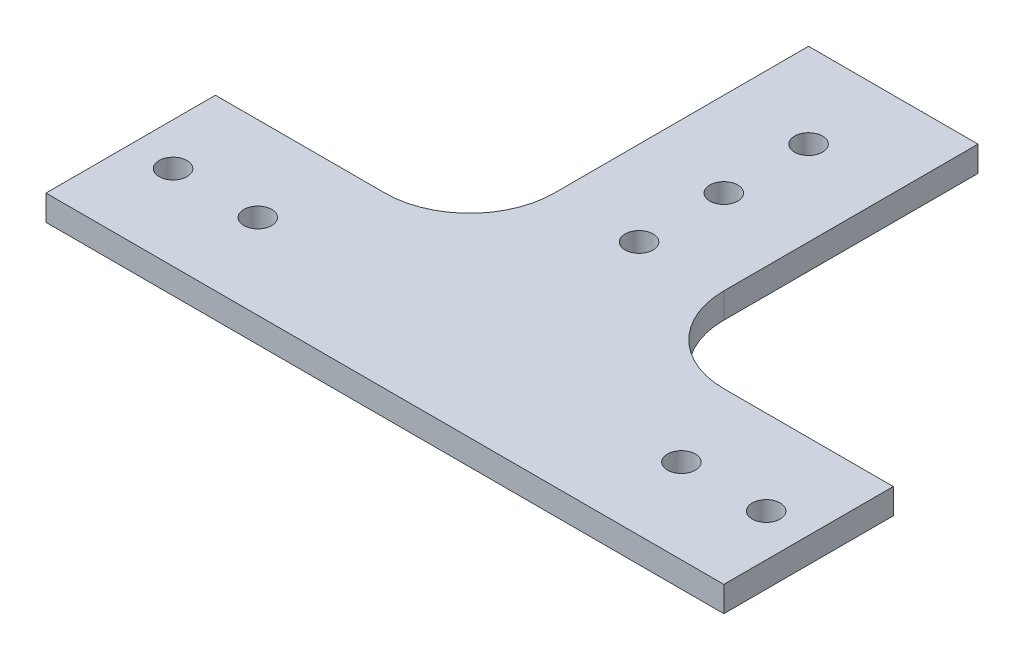
ISO-10303-21;
HEADER;
FILE_DESCRIPTION(('STEP AP214'),'2;1');
FILE_NAME('part.step','',(''),(''),'','','');
FILE_SCHEMA(('AUTOMOTIVE_DESIGN { 1 0 10303 214 1 1 1 1 }'));
ENDSEC;
DATA;
#1=APPLICATION_CONTEXT('core data for automotive mechanical design processes');
#2=APPLICATION_PROTOCOL_DEFINITION('international standard','automotive_design',2000,#1);
#3=PRODUCT_CONTEXT('',#1,'mechanical');
#4=PRODUCT('Part','Part','',(#3));
#5=PRODUCT_RELATED_PRODUCT_CATEGORY('part','',(#4));
#6=PRODUCT_DEFINITION_FORMATION('','',#4);
#7=PRODUCT_DEFINITION_CONTEXT('part definition',#1,'design');
#8=PRODUCT_DEFINITION('design','',#6,#7);
#9=PRODUCT_DEFINITION_SHAPE('','',#8);
#10=(LENGTH_UNIT() NAMED_UNIT(*) SI_UNIT(.MILLI.,.METRE.));
#11=(NAMED_UNIT(*) PLANE_ANGLE_UNIT() SI_UNIT($,.RADIAN.));
#12=(NAMED_UNIT(*) SI_UNIT($,.STERADIAN.) SOLID_ANGLE_UNIT());
#13=UNCERTAINTY_MEASURE_WITH_UNIT(LENGTH_MEASURE(1.E-05),#10,'distance_accuracy_value','');
#14=(GEOMETRIC_REPRESENTATION_CONTEXT(3) GLOBAL_UNCERTAINTY_ASSIGNED_CONTEXT((#13)) GLOBAL_UNIT_ASSIGNED_CONTEXT((#10,
#11,#12)) REPRESENTATION_CONTEXT('',''));
#15=CARTESIAN_POINT('',(0.,0.,0.));
#16=DIRECTION('',(0.,0.,1.));
#17=DIRECTION('',(1.,0.,0.));
#18=AXIS2_PLACEMENT_3D('',#15,#16,#17);
#19=CARTESIAN_POINT('',(0.,3.,0.));
#20=DIRECTION('',(0.,1.,0.));
#21=DIRECTION('',(0.,0.,1.));
#22=AXIS2_PLACEMENT_3D('',#19,#20,#21);
#23=PLANE('',#22);
#24=CARTESIAN_POINT('',(24.6658917252566,3.,20.3341082747434));
#25=DIRECTION('',(0.,1.,0.));
#26=DIRECTION('',(0.,0.,1.));
#27=AXIS2_PLACEMENT_3D('',#24,#25,#26);
#28=CIRCLE('',#27,1.65);
#29=CARTESIAN_POINT('',(24.6658917252566,3.,21.9841082747434));
#30=VERTEX_POINT('',#29);
#31=EDGE_CURVE('E244',#30,#30,#28,.T.);
#32=ORIENTED_EDGE('',*,*,#31,.F.);
#33=EDGE_LOOP('',(#32));
#34=FACE_BOUND('',#33,.T.);
#35=CARTESIAN_POINT('',(-25.3341082747434,3.,20.3341082747434));
#36=DIRECTION('',(0.,1.,0.));
#37=DIRECTION('',(0.,0.,1.));
#38=AXIS2_PLACEMENT_3D('',#35,#36,#37);
#39=CIRCLE('',#38,1.65);
#40=CARTESIAN_POINT('',(-25.3341082747434,3.,21.9841082747434));
#41=VERTEX_POINT('',#40);
#42=EDGE_CURVE('E232',#41,#41,#39,.T.);
#43=ORIENTED_EDGE('',*,*,#42,.F.);
#44=EDGE_LOOP('',(#43));
#45=FACE_BOUND('',#44,.T.);
#46=CARTESIAN_POINT('',(-0.334108274743422,3.,-9.6658917252566));
#47=DIRECTION('',(0.,1.,0.));
#48=DIRECTION('',(0.,0.,1.));
#49=AXIS2_PLACEMENT_3D('',#46,#47,#48);
#50=CIRCLE('',#49,1.65);
#51=CARTESIAN_POINT('',(-0.334108274743422,3.,-8.0158917252566));
#52=VERTEX_POINT('',#51);
#53=EDGE_CURVE('E220',#52,#52,#50,.T.);
#54=ORIENTED_EDGE('',*,*,#53,.F.);
#55=EDGE_LOOP('',(#54));
#56=FACE_BOUND('',#55,.T.);
#57=DIRECTION('',(0.,0.,1.));
#58=VECTOR('',#57,1.);
#59=CARTESIAN_POINT('',(-40.3341082747434,3.,10.3341082747434));
#60=LINE('',#59,#58);
#61=CARTESIAN_POINT('',(-40.3341082747434,3.,10.3341082747434));
#62=VERTEX_POINT('',#61);
#63=CARTESIAN_POINT('',(-40.3341082747434,3.,30.3341082747434));
#64=VERTEX_POINT('',#63);
#65=EDGE_CURVE('E129',#62,#64,#60,.T.);
#66=ORIENTED_EDGE('',*,*,#65,.T.);
#67=DIRECTION('',(1.,0.,0.));
#68=VECTOR('',#67,1.);
#69=CARTESIAN_POINT('',(-40.3341082747434,3.,30.3341082747434));
#70=LINE('',#69,#68);
#71=CARTESIAN_POINT('',(39.6658917252566,3.,30.3341082747434));
#72=VERTEX_POINT('',#71);
#73=EDGE_CURVE('E118',#64,#72,#70,.T.);
#74=ORIENTED_EDGE('',*,*,#73,.T.);
#75=DIRECTION('',(0.,0.,-1.));
#76=VECTOR('',#75,1.);
#77=CARTESIAN_POINT('',(39.6658917252566,3.,30.3341082747434));
#78=LINE('',#77,#76);
#79=CARTESIAN_POINT('',(39.6658917252566,3.,10.3341082747434));
#80=VERTEX_POINT('',#79);
#81=EDGE_CURVE('E128',#72,#80,#78,.T.);
#82=ORIENTED_EDGE('',*,*,#81,.T.);
#83=DIRECTION('',(-1.,0.,0.));
#84=VECTOR('',#83,1.);
#85=CARTESIAN_POINT('',(39.6658917252566,3.,10.3341082747434));
#86=LINE('',#85,#84);
#87=CARTESIAN_POINT('',(19.6658917252566,3.,10.3341082747434));
#88=VERTEX_POINT('',#87);
#89=EDGE_CURVE('E199',#80,#88,#86,.T.);
#90=ORIENTED_EDGE('',*,*,#89,.T.);
#91=CARTESIAN_POINT('',(19.6658917252566,3.,0.334108274743408));
#92=DIRECTION('',(0.,1.,0.));
#93=DIRECTION('',(0.,0.,1.));
#94=AXIS2_PLACEMENT_3D('',#91,#92,#93);
#95=CIRCLE('',#94,10.);
#96=CARTESIAN_POINT('',(9.66589172525658,3.,0.334108274743408));
#97=VERTEX_POINT('',#96);
#98=EDGE_CURVE('E11',#88,#97,#95,.F.);
#99=ORIENTED_EDGE('',*,*,#98,.T.);
#100=DIRECTION('',(0.,0.,-1.));
#101=VECTOR('',#100,1.);
#102=CARTESIAN_POINT('',(9.66589172525658,3.,10.3341082747434));
#103=LINE('',#102,#101);
#104=CARTESIAN_POINT('',(9.66589172525658,3.,-29.6658917252566));
#105=VERTEX_POINT('',#104);
#106=EDGE_CURVE('E213',#97,#105,#103,.T.);
#107=ORIENTED_EDGE('',*,*,#106,.T.);
#108=DIRECTION('',(-1.,0.,0.));
#109=VECTOR('',#108,1.);
#110=CARTESIAN_POINT('',(9.66589172525658,3.,-29.6658917252566));
#111=LINE('',#110,#109);
#112=CARTESIAN_POINT('',(-10.3341082747434,3.,-29.6658917252566));
#113=VERTEX_POINT('',#112);
#114=EDGE_CURVE('E211',#105,#113,#111,.T.);
#115=ORIENTED_EDGE('',*,*,#114,.T.);
#116=DIRECTION('',(0.,0.,1.));
#117=VECTOR('',#116,1.);
#118=CARTESIAN_POINT('',(-10.3341082747434,3.,-29.6658917252566));
#119=LINE('',#118,#117);
#120=CARTESIAN_POINT('',(-10.3341082747434,3.,0.334108274743408));
#121=VERTEX_POINT('',#120);
#122=EDGE_CURVE('E163',#113,#121,#119,.T.);
#123=ORIENTED_EDGE('',*,*,#122,.T.);
#124=CARTESIAN_POINT('',(-20.3341082747434,3.,0.334108274743409));
#125=DIRECTION('',(0.,1.,0.));
#126=DIRECTION('',(0.,0.,1.));
#127=AXIS2_PLACEMENT_3D('',#124,#125,#126);
#128=CIRCLE('',#127,10.);
#129=CARTESIAN_POINT('',(-20.3341082747434,3.,10.3341082747434));
#130=VERTEX_POINT('',#129);
#131=EDGE_CURVE('E159',#121,#130,#128,.F.);
#132=ORIENTED_EDGE('',*,*,#131,.T.);
#133=DIRECTION('',(-1.,0.,0.));
#134=VECTOR('',#133,1.);
#135=CARTESIAN_POINT('',(-10.3341082747434,3.,10.3341082747434));
#136=LINE('',#135,#134);
#137=EDGE_CURVE('E134',#130,#62,#136,.T.);
#138=ORIENTED_EDGE('',*,*,#137,.T.);
#139=EDGE_LOOP('',(#66,#74,#82,#90,#99,#107,#115,#123,#132,#138));
#140=FACE_BOUND('',#139,.T.);
#141=CARTESIAN_POINT('',(-0.334108274743422,3.,0.334108274743412));
#142=DIRECTION('',(0.,1.,0.));
#143=DIRECTION('',(0.,0.,1.));
#144=AXIS2_PLACEMENT_3D('',#141,#142,#143);
#145=CIRCLE('',#144,1.65);
#146=CARTESIAN_POINT('',(-0.334108274743422,3.,1.98410827474341));
#147=VERTEX_POINT('',#146);
#148=EDGE_CURVE('E208',#147,#147,#145,.T.);
#149=ORIENTED_EDGE('',*,*,#148,.F.);
#150=EDGE_LOOP('',(#149));
#151=FACE_BOUND('',#150,.T.);
#152=CARTESIAN_POINT('',(-0.334108274743422,3.,-19.6658917252566));
#153=DIRECTION('',(0.,1.,0.));
#154=DIRECTION('',(0.,0.,1.));
#155=AXIS2_PLACEMENT_3D('',#152,#153,#154);
#156=CIRCLE('',#155,1.65);
#157=CARTESIAN_POINT('',(-0.334108274743422,3.,-18.0158917252566));
#158=VERTEX_POINT('',#157);
#159=EDGE_CURVE('E226',#158,#158,#156,.T.);
#160=ORIENTED_EDGE('',*,*,#159,.F.);
#161=EDGE_LOOP('',(#160));
#162=FACE_BOUND('',#161,.T.);
#163=CARTESIAN_POINT('',(-35.3341082747434,3.,20.3341082747434));
#164=DIRECTION('',(0.,1.,0.));
#165=DIRECTION('',(0.,0.,1.));
#166=AXIS2_PLACEMENT_3D('',#163,#164,#165);
#167=CIRCLE('',#166,1.65);
#168=CARTESIAN_POINT('',(-35.3341082747434,3.,21.9841082747434));
#169=VERTEX_POINT('',#168);
#170=EDGE_CURVE('E238',#169,#169,#167,.T.);
#171=ORIENTED_EDGE('',*,*,#170,.F.);
#172=EDGE_LOOP('',(#171));
#173=FACE_BOUND('',#172,.T.);
#174=CARTESIAN_POINT('',(34.6658917252566,3.,20.3341082747434));
#175=DIRECTION('',(0.,1.,0.));
#176=DIRECTION('',(0.,0.,1.));
#177=AXIS2_PLACEMENT_3D('',#174,#175,#176);
#178=CIRCLE('',#177,1.65);
#179=CARTESIAN_POINT('',(34.6658917252566,3.,21.9841082747434));
#180=VERTEX_POINT('',#179);
#181=EDGE_CURVE('E250',#180,#180,#178,.T.);
#182=ORIENTED_EDGE('',*,*,#181,.F.);
#183=EDGE_LOOP('',(#182));
#184=FACE_BOUND('',#183,.T.);
#185=ADVANCED_FACE('F41',(#34,#45,#56,#140,#151,#162,#173,#184),#23,.T.);
#186=CARTESIAN_POINT('',(0.,0.,0.));
#187=DIRECTION('',(0.,1.,0.));
#188=DIRECTION('',(0.,0.,1.));
#189=AXIS2_PLACEMENT_3D('',#186,#187,#188);
#190=PLANE('',#189);
#191=DIRECTION('',(0.,0.,1.));
#192=VECTOR('',#191,1.);
#193=CARTESIAN_POINT('',(-40.3341082747434,0.,10.3341082747434));
#194=LINE('',#193,#192);
#195=CARTESIAN_POINT('',(-40.3341082747434,0.,10.3341082747434));
#196=VERTEX_POINT('',#195);
#197=CARTESIAN_POINT('',(-40.3341082747434,0.,30.3341082747434));
#198=VERTEX_POINT('',#197);
#199=EDGE_CURVE('E142',#196,#198,#194,.T.);
#200=ORIENTED_EDGE('',*,*,#199,.F.);
#201=DIRECTION('',(-1.,0.,0.));
#202=VECTOR('',#201,1.);
#203=CARTESIAN_POINT('',(-10.3341082747434,0.,10.3341082747434));
#204=LINE('',#203,#202);
#205=CARTESIAN_POINT('',(-20.3341082747434,0.,10.3341082747434));
#206=VERTEX_POINT('',#205);
#207=EDGE_CURVE('E138',#206,#196,#204,.T.);
#208=ORIENTED_EDGE('',*,*,#207,.F.);
#209=CARTESIAN_POINT('',(-20.3341082747434,0.,0.334108274743409));
#210=DIRECTION('',(0.,1.,0.));
#211=DIRECTION('',(0.,0.,1.));
#212=AXIS2_PLACEMENT_3D('',#209,#210,#211);
#213=CIRCLE('',#212,10.);
#214=CARTESIAN_POINT('',(-10.3341082747434,0.,0.334108274743408));
#215=VERTEX_POINT('',#214);
#216=EDGE_CURVE('E157',#206,#215,#213,.T.);
#217=ORIENTED_EDGE('',*,*,#216,.T.);
#218=DIRECTION('',(0.,0.,1.));
#219=VECTOR('',#218,1.);
#220=CARTESIAN_POINT('',(-10.3341082747434,0.,-29.6658917252566));
#221=LINE('',#220,#219);
#222=CARTESIAN_POINT('',(-10.3341082747434,0.,-29.6658917252566));
#223=VERTEX_POINT('',#222);
#224=EDGE_CURVE('E178',#223,#215,#221,.T.);
#225=ORIENTED_EDGE('',*,*,#224,.F.);
#226=DIRECTION('',(-1.,0.,0.));
#227=VECTOR('',#226,1.);
#228=CARTESIAN_POINT('',(9.66589172525658,0.,-29.6658917252566));
#229=LINE('',#228,#227);
#230=CARTESIAN_POINT('',(9.66589172525658,0.,-29.6658917252566));
#231=VERTEX_POINT('',#230);
#232=EDGE_CURVE('E184',#231,#223,#229,.T.);
#233=ORIENTED_EDGE('',*,*,#232,.F.);
#234=DIRECTION('',(0.,0.,-1.));
#235=VECTOR('',#234,1.);
#236=CARTESIAN_POINT('',(9.66589172525658,0.,10.3341082747434));
#237=LINE('',#236,#235);
#238=CARTESIAN_POINT('',(9.66589172525658,0.,0.334108274743408));
#239=VERTEX_POINT('',#238);
#240=EDGE_CURVE('E187',#239,#231,#237,.T.);
#241=ORIENTED_EDGE('',*,*,#240,.F.);
#242=CARTESIAN_POINT('',(19.6658917252566,0.,0.334108274743408));
#243=DIRECTION('',(0.,1.,0.));
#244=DIRECTION('',(0.,0.,1.));
#245=AXIS2_PLACEMENT_3D('',#242,#243,#244);
#246=CIRCLE('',#245,10.);
#247=CARTESIAN_POINT('',(19.6658917252566,0.,10.3341082747434));
#248=VERTEX_POINT('',#247);
#249=EDGE_CURVE('E49',#239,#248,#246,.T.);
#250=ORIENTED_EDGE('',*,*,#249,.T.);
#251=DIRECTION('',(-1.,0.,0.));
#252=VECTOR('',#251,1.);
#253=CARTESIAN_POINT('',(39.6658917252566,0.,10.3341082747434));
#254=LINE('',#253,#252);
#255=CARTESIAN_POINT('',(39.6658917252566,0.,10.3341082747434));
#256=VERTEX_POINT('',#255);
#257=EDGE_CURVE('E198',#256,#248,#254,.T.);
#258=ORIENTED_EDGE('',*,*,#257,.F.);
#259=DIRECTION('',(0.,0.,-1.));
#260=VECTOR('',#259,1.);
#261=CARTESIAN_POINT('',(39.6658917252566,0.,30.3341082747434));
#262=LINE('',#261,#260);
#263=CARTESIAN_POINT('',(39.6658917252566,0.,30.3341082747434));
#264=VERTEX_POINT('',#263);
#265=EDGE_CURVE('E202',#264,#256,#262,.T.);
#266=ORIENTED_EDGE('',*,*,#265,.F.);
#267=DIRECTION('',(1.,0.,0.));
#268=VECTOR('',#267,1.);
#269=CARTESIAN_POINT('',(-40.3341082747434,0.,30.3341082747434));
#270=LINE('',#269,#268);
#271=EDGE_CURVE('E204',#198,#264,#270,.T.);
#272=ORIENTED_EDGE('',*,*,#271,.F.);
#273=EDGE_LOOP('',(#200,#208,#217,#225,#233,#241,#250,#258,#266,#272));
#274=FACE_BOUND('',#273,.T.);
#275=CARTESIAN_POINT('',(-0.334108274743422,0.,0.334108274743412));
#276=DIRECTION('',(0.,1.,0.));
#277=DIRECTION('',(0.,0.,1.));
#278=AXIS2_PLACEMENT_3D('',#275,#276,#277);
#279=CIRCLE('',#278,1.65);
#280=CARTESIAN_POINT('',(-0.334108274743422,0.,1.98410827474341));
#281=VERTEX_POINT('',#280);
#282=EDGE_CURVE('E217',#281,#281,#279,.T.);
#283=ORIENTED_EDGE('',*,*,#282,.T.);
#284=EDGE_LOOP('',(#283));
#285=FACE_BOUND('',#284,.T.);
#286=CARTESIAN_POINT('',(-0.334108274743422,0.,-9.6658917252566));
#287=DIRECTION('',(0.,1.,0.));
#288=DIRECTION('',(0.,0.,1.));
#289=AXIS2_PLACEMENT_3D('',#286,#287,#288);
#290=CIRCLE('',#289,1.65);
#291=CARTESIAN_POINT('',(-0.334108274743422,0.,-8.0158917252566));
#292=VERTEX_POINT('',#291);
#293=EDGE_CURVE('E223',#292,#292,#290,.T.);
#294=ORIENTED_EDGE('',*,*,#293,.T.);
#295=EDGE_LOOP('',(#294));
#296=FACE_BOUND('',#295,.T.);
#297=CARTESIAN_POINT('',(-0.334108274743422,0.,-19.6658917252566));
#298=DIRECTION('',(0.,1.,0.));
#299=DIRECTION('',(0.,0.,1.));
#300=AXIS2_PLACEMENT_3D('',#297,#298,#299);
#301=CIRCLE('',#300,1.65);
#302=CARTESIAN_POINT('',(-0.334108274743422,0.,-18.0158917252566));
#303=VERTEX_POINT('',#302);
#304=EDGE_CURVE('E229',#303,#303,#301,.T.);
#305=ORIENTED_EDGE('',*,*,#304,.T.);
#306=EDGE_LOOP('',(#305));
#307=FACE_BOUND('',#306,.T.);
#308=CARTESIAN_POINT('',(-25.3341082747434,0.,20.3341082747434));
#309=DIRECTION('',(0.,1.,0.));
#310=DIRECTION('',(0.,0.,1.));
#311=AXIS2_PLACEMENT_3D('',#308,#309,#310);
#312=CIRCLE('',#311,1.65);
#313=CARTESIAN_POINT('',(-25.3341082747434,0.,21.9841082747434));
#314=VERTEX_POINT('',#313);
#315=EDGE_CURVE('E235',#314,#314,#312,.T.);
#316=ORIENTED_EDGE('',*,*,#315,.T.);
#317=EDGE_LOOP('',(#316));
#318=FACE_BOUND('',#317,.T.);
#319=CARTESIAN_POINT('',(-35.3341082747434,0.,20.3341082747434));
#320=DIRECTION('',(0.,1.,0.));
#321=DIRECTION('',(0.,0.,1.));
#322=AXIS2_PLACEMENT_3D('',#319,#320,#321);
#323=CIRCLE('',#322,1.65);
#324=CARTESIAN_POINT('',(-35.3341082747434,0.,21.9841082747434));
#325=VERTEX_POINT('',#324);
#326=EDGE_CURVE('E241',#325,#325,#323,.T.);
#327=ORIENTED_EDGE('',*,*,#326,.T.);
#328=EDGE_LOOP('',(#327));
#329=FACE_BOUND('',#328,.T.);
#330=CARTESIAN_POINT('',(24.6658917252566,0.,20.3341082747434));
#331=DIRECTION('',(0.,1.,0.));
#332=DIRECTION('',(0.,0.,1.));
#333=AXIS2_PLACEMENT_3D('',#330,#331,#332);
#334=CIRCLE('',#333,1.65);
#335=CARTESIAN_POINT('',(24.6658917252566,0.,21.9841082747434));
#336=VERTEX_POINT('',#335);
#337=EDGE_CURVE('E247',#336,#336,#334,.T.);
#338=ORIENTED_EDGE('',*,*,#337,.T.);
#339=EDGE_LOOP('',(#338));
#340=FACE_BOUND('',#339,.T.);
#341=CARTESIAN_POINT('',(34.6658917252566,0.,20.3341082747434));
#342=DIRECTION('',(0.,1.,0.));
#343=DIRECTION('',(0.,0.,1.));
#344=AXIS2_PLACEMENT_3D('',#341,#342,#343);
#345=CIRCLE('',#344,1.65);
#346=CARTESIAN_POINT('',(34.6658917252566,0.,21.9841082747434));
#347=VERTEX_POINT('',#346);
#348=EDGE_CURVE('E253',#347,#347,#345,.T.);
#349=ORIENTED_EDGE('',*,*,#348,.T.);
#350=EDGE_LOOP('',(#349));
#351=FACE_BOUND('',#350,.T.);
#352=ADVANCED_FACE('F175',(#274,#285,#296,#307,#318,#329,#340,#351),#190,.F.);
#353=CARTESIAN_POINT('',(-40.3341082747434,3.,10.3341082747434));
#354=DIRECTION('',(1.,0.,0.));
#355=DIRECTION('',(0.,0.,-1.));
#356=AXIS2_PLACEMENT_3D('',#353,#354,#355);
#357=PLANE('',#356);
#358=ORIENTED_EDGE('',*,*,#199,.T.);
#359=DIRECTION('',(0.,-1.,0.));
#360=VECTOR('',#359,1.);
#361=CARTESIAN_POINT('',(-40.3341082747434,3.,30.3341082747434));
#362=LINE('',#361,#360);
#363=EDGE_CURVE('E122',#64,#198,#362,.T.);
#364=ORIENTED_EDGE('',*,*,#363,.F.);
#365=ORIENTED_EDGE('',*,*,#65,.F.);
#366=DIRECTION('',(0.,-1.,0.));
#367=VECTOR('',#366,1.);
#368=CARTESIAN_POINT('',(-40.3341082747434,3.,10.3341082747434));
#369=LINE('',#368,#367);
#370=EDGE_CURVE('E170',#62,#196,#369,.T.);
#371=ORIENTED_EDGE('',*,*,#370,.T.);
#372=EDGE_LOOP('',(#358,#364,#365,#371));
#373=FACE_BOUND('',#372,.T.);
#374=ADVANCED_FACE('F140',(#373),#357,.F.);
#375=CARTESIAN_POINT('',(-40.3341082747434,3.,30.3341082747434));
#376=DIRECTION('',(0.,0.,-1.));
#377=DIRECTION('',(-1.,0.,0.));
#378=AXIS2_PLACEMENT_3D('',#375,#376,#377);
#379=PLANE('',#378);
#380=ORIENTED_EDGE('',*,*,#271,.T.);
#381=DIRECTION('',(0.,-1.,0.));
#382=VECTOR('',#381,1.);
#383=CARTESIAN_POINT('',(39.6658917252566,3.,30.3341082747434));
#384=LINE('',#383,#382);
#385=EDGE_CURVE('E125',#72,#264,#384,.T.);
#386=ORIENTED_EDGE('',*,*,#385,.F.);
#387=ORIENTED_EDGE('',*,*,#73,.F.);
#388=ORIENTED_EDGE('',*,*,#363,.T.);
#389=EDGE_LOOP('',(#380,#386,#387,#388));
#390=FACE_BOUND('',#389,.T.);
#391=ADVANCED_FACE('F120',(#390),#379,.F.);
#392=CARTESIAN_POINT('',(39.6658917252566,3.,30.3341082747434));
#393=DIRECTION('',(-1.,0.,0.));
#394=DIRECTION('',(0.,0.,1.));
#395=AXIS2_PLACEMENT_3D('',#392,#393,#394);
#396=PLANE('',#395);
#397=ORIENTED_EDGE('',*,*,#265,.T.);
#398=DIRECTION('',(0.,-1.,0.));
#399=VECTOR('',#398,1.);
#400=CARTESIAN_POINT('',(39.6658917252566,3.,10.3341082747434));
#401=LINE('',#400,#399);
#402=EDGE_CURVE('E148',#80,#256,#401,.T.);
#403=ORIENTED_EDGE('',*,*,#402,.F.);
#404=ORIENTED_EDGE('',*,*,#81,.F.);
#405=ORIENTED_EDGE('',*,*,#385,.T.);
#406=EDGE_LOOP('',(#397,#403,#404,#405));
#407=FACE_BOUND('',#406,.T.);
#408=ADVANCED_FACE('F290',(#407),#396,.F.);
#409=CARTESIAN_POINT('',(39.6658917252566,3.,10.3341082747434));
#410=DIRECTION('',(0.,0.,1.));
#411=DIRECTION('',(1.,0.,0.));
#412=AXIS2_PLACEMENT_3D('',#409,#410,#411);
#413=PLANE('',#412);
#414=ORIENTED_EDGE('',*,*,#257,.T.);
#415=DIRECTION('',(0.,-1.,0.));
#416=VECTOR('',#415,1.);
#417=CARTESIAN_POINT('',(19.6658917252566,3.,10.3341082747434));
#418=LINE('',#417,#416);
#419=EDGE_CURVE('E56',#248,#88,#418,.F.);
#420=ORIENTED_EDGE('',*,*,#419,.T.);
#421=ORIENTED_EDGE('',*,*,#89,.F.);
#422=ORIENTED_EDGE('',*,*,#402,.T.);
#423=EDGE_LOOP('',(#414,#420,#421,#422));
#424=FACE_BOUND('',#423,.T.);
#425=ADVANCED_FACE('F197',(#424),#413,.F.);
#426=CARTESIAN_POINT('',(9.66589172525658,3.,10.3341082747434));
#427=DIRECTION('',(-1.,0.,0.));
#428=DIRECTION('',(0.,0.,1.));
#429=AXIS2_PLACEMENT_3D('',#426,#427,#428);
#430=PLANE('',#429);
#431=ORIENTED_EDGE('',*,*,#106,.F.);
#432=DIRECTION('',(0.,-1.,0.));
#433=VECTOR('',#432,1.);
#434=CARTESIAN_POINT('',(9.66589172525658,0.,0.334108274743408));
#435=LINE('',#434,#433);
#436=EDGE_CURVE('E153',#97,#239,#435,.T.);
#437=ORIENTED_EDGE('',*,*,#436,.T.);
#438=ORIENTED_EDGE('',*,*,#240,.T.);
#439=DIRECTION('',(0.,-1.,0.));
#440=VECTOR('',#439,1.);
#441=CARTESIAN_POINT('',(9.66589172525658,3.,-29.6658917252566));
#442=LINE('',#441,#440);
#443=EDGE_CURVE('E193',#105,#231,#442,.T.);
#444=ORIENTED_EDGE('',*,*,#443,.F.);
#445=EDGE_LOOP('',(#431,#437,#438,#444));
#446=FACE_BOUND('',#445,.T.);
#447=ADVANCED_FACE('F283',(#446),#430,.F.);
#448=CARTESIAN_POINT('',(9.66589172525658,3.,-29.6658917252566));
#449=DIRECTION('',(0.,0.,1.));
#450=DIRECTION('',(1.,0.,0.));
#451=AXIS2_PLACEMENT_3D('',#448,#449,#450);
#452=PLANE('',#451);
#453=ORIENTED_EDGE('',*,*,#232,.T.);
#454=DIRECTION('',(0.,-1.,0.));
#455=VECTOR('',#454,1.);
#456=CARTESIAN_POINT('',(-10.3341082747434,3.,-29.6658917252566));
#457=LINE('',#456,#455);
#458=EDGE_CURVE('E183',#113,#223,#457,.T.);
#459=ORIENTED_EDGE('',*,*,#458,.F.);
#460=ORIENTED_EDGE('',*,*,#114,.F.);
#461=ORIENTED_EDGE('',*,*,#443,.T.);
#462=EDGE_LOOP('',(#453,#459,#460,#461));
#463=FACE_BOUND('',#462,.T.);
#464=ADVANCED_FACE('F280',(#463),#452,.F.);
#465=CARTESIAN_POINT('',(-10.3341082747434,3.,-29.6658917252566));
#466=DIRECTION('',(1.,0.,0.));
#467=DIRECTION('',(0.,0.,-1.));
#468=AXIS2_PLACEMENT_3D('',#465,#466,#467);
#469=PLANE('',#468);
#470=ORIENTED_EDGE('',*,*,#224,.T.);
#471=DIRECTION('',(0.,-1.,0.));
#472=VECTOR('',#471,1.);
#473=CARTESIAN_POINT('',(-10.3341082747434,3.,0.334108274743409));
#474=LINE('',#473,#472);
#475=EDGE_CURVE('E146',#215,#121,#474,.F.);
#476=ORIENTED_EDGE('',*,*,#475,.T.);
#477=ORIENTED_EDGE('',*,*,#122,.F.);
#478=ORIENTED_EDGE('',*,*,#458,.T.);
#479=EDGE_LOOP('',(#470,#476,#477,#478));
#480=FACE_BOUND('',#479,.T.);
#481=ADVANCED_FACE('F181',(#480),#469,.F.);
#482=CARTESIAN_POINT('',(-10.3341082747434,3.,10.3341082747434));
#483=DIRECTION('',(0.,0.,1.));
#484=DIRECTION('',(1.,0.,0.));
#485=AXIS2_PLACEMENT_3D('',#482,#483,#484);
#486=PLANE('',#485);
#487=ORIENTED_EDGE('',*,*,#137,.F.);
#488=DIRECTION('',(0.,-1.,0.));
#489=VECTOR('',#488,1.);
#490=CARTESIAN_POINT('',(-20.3341082747434,0.,10.3341082747434));
#491=LINE('',#490,#489);
#492=EDGE_CURVE('E143',#130,#206,#491,.T.);
#493=ORIENTED_EDGE('',*,*,#492,.T.);
#494=ORIENTED_EDGE('',*,*,#207,.T.);
#495=ORIENTED_EDGE('',*,*,#370,.F.);
#496=EDGE_LOOP('',(#487,#493,#494,#495));
#497=FACE_BOUND('',#496,.T.);
#498=ADVANCED_FACE('F168',(#497),#486,.F.);
#499=CARTESIAN_POINT('',(-0.334108274743422,3.,0.334108274743412));
#500=DIRECTION('',(0.,-1.,0.));
#501=DIRECTION('',(0.,0.,-1.));
#502=AXIS2_PLACEMENT_3D('',#499,#500,#501);
#503=CYLINDRICAL_SURFACE('',#502,1.65);
#504=ORIENTED_EDGE('',*,*,#148,.T.);
#505=EDGE_LOOP('',(#504));
#506=FACE_BOUND('',#505,.T.);
#507=ORIENTED_EDGE('',*,*,#282,.F.);
#508=EDGE_LOOP('',(#507));
#509=FACE_BOUND('',#508,.T.);
#510=ADVANCED_FACE('F273',(#506,#509),#503,.F.);
#511=CARTESIAN_POINT('',(-0.334108274743422,3.,-9.6658917252566));
#512=DIRECTION('',(0.,-1.,0.));
#513=DIRECTION('',(0.,0.,-1.));
#514=AXIS2_PLACEMENT_3D('',#511,#512,#513);
#515=CYLINDRICAL_SURFACE('',#514,1.65);
#516=ORIENTED_EDGE('',*,*,#53,.T.);
#517=EDGE_LOOP('',(#516));
#518=FACE_BOUND('',#517,.T.);
#519=ORIENTED_EDGE('',*,*,#293,.F.);
#520=EDGE_LOOP('',(#519));
#521=FACE_BOUND('',#520,.T.);
#522=ADVANCED_FACE('F319',(#518,#521),#515,.F.);
#523=CARTESIAN_POINT('',(-0.334108274743422,3.,-19.6658917252566));
#524=DIRECTION('',(0.,-1.,0.));
#525=DIRECTION('',(0.,0.,-1.));
#526=AXIS2_PLACEMENT_3D('',#523,#524,#525);
#527=CYLINDRICAL_SURFACE('',#526,1.65);
#528=ORIENTED_EDGE('',*,*,#159,.T.);
#529=EDGE_LOOP('',(#528));
#530=FACE_BOUND('',#529,.T.);
#531=ORIENTED_EDGE('',*,*,#304,.F.);
#532=EDGE_LOOP('',(#531));
#533=FACE_BOUND('',#532,.T.);
#534=ADVANCED_FACE('F316',(#530,#533),#527,.F.);
#535=CARTESIAN_POINT('',(-25.3341082747434,3.,20.3341082747434));
#536=DIRECTION('',(0.,-1.,0.));
#537=DIRECTION('',(0.,0.,-1.));
#538=AXIS2_PLACEMENT_3D('',#535,#536,#537);
#539=CYLINDRICAL_SURFACE('',#538,1.65);
#540=ORIENTED_EDGE('',*,*,#42,.T.);
#541=EDGE_LOOP('',(#540));
#542=FACE_BOUND('',#541,.T.);
#543=ORIENTED_EDGE('',*,*,#315,.F.);
#544=EDGE_LOOP('',(#543));
#545=FACE_BOUND('',#544,.T.);
#546=ADVANCED_FACE('F312',(#542,#545),#539,.F.);
#547=CARTESIAN_POINT('',(-35.3341082747434,3.,20.3341082747434));
#548=DIRECTION('',(0.,-1.,0.));
#549=DIRECTION('',(0.,0.,-1.));
#550=AXIS2_PLACEMENT_3D('',#547,#548,#549);
#551=CYLINDRICAL_SURFACE('',#550,1.65);
#552=ORIENTED_EDGE('',*,*,#170,.T.);
#553=EDGE_LOOP('',(#552));
#554=FACE_BOUND('',#553,.T.);
#555=ORIENTED_EDGE('',*,*,#326,.F.);
#556=EDGE_LOOP('',(#555));
#557=FACE_BOUND('',#556,.T.);
#558=ADVANCED_FACE('F306',(#554,#557),#551,.F.);
#559=CARTESIAN_POINT('',(24.6658917252566,3.,20.3341082747434));
#560=DIRECTION('',(0.,-1.,0.));
#561=DIRECTION('',(0.,0.,-1.));
#562=AXIS2_PLACEMENT_3D('',#559,#560,#561);
#563=CYLINDRICAL_SURFACE('',#562,1.65);
#564=ORIENTED_EDGE('',*,*,#31,.T.);
#565=EDGE_LOOP('',(#564));
#566=FACE_BOUND('',#565,.T.);
#567=ORIENTED_EDGE('',*,*,#337,.F.);
#568=EDGE_LOOP('',(#567));
#569=FACE_BOUND('',#568,.T.);
#570=ADVANCED_FACE('F301',(#566,#569),#563,.F.);
#571=CARTESIAN_POINT('',(34.6658917252566,3.,20.3341082747434));
#572=DIRECTION('',(0.,-1.,0.));
#573=DIRECTION('',(0.,0.,-1.));
#574=AXIS2_PLACEMENT_3D('',#571,#572,#573);
#575=CYLINDRICAL_SURFACE('',#574,1.65);
#576=ORIENTED_EDGE('',*,*,#181,.T.);
#577=EDGE_LOOP('',(#576));
#578=FACE_BOUND('',#577,.T.);
#579=ORIENTED_EDGE('',*,*,#348,.F.);
#580=EDGE_LOOP('',(#579));
#581=FACE_BOUND('',#580,.T.);
#582=ADVANCED_FACE('F259',(#578,#581),#575,.F.);
#583=CARTESIAN_POINT('',(-20.3341082747434,3.,0.334108274743409));
#584=DIRECTION('',(0.,1.,0.));
#585=DIRECTION('',(0.,0.,1.));
#586=AXIS2_PLACEMENT_3D('',#583,#584,#585);
#587=CYLINDRICAL_SURFACE('',#586,10.);
#588=ORIENTED_EDGE('',*,*,#131,.F.);
#589=ORIENTED_EDGE('',*,*,#475,.F.);
#590=ORIENTED_EDGE('',*,*,#216,.F.);
#591=ORIENTED_EDGE('',*,*,#492,.F.);
#592=EDGE_LOOP('',(#588,#589,#590,#591));
#593=FACE_BOUND('',#592,.T.);
#594=ADVANCED_FACE('F172',(#593),#587,.F.);
#595=CARTESIAN_POINT('',(19.6658917252566,3.,0.334108274743408));
#596=DIRECTION('',(0.,1.,0.));
#597=DIRECTION('',(0.,0.,1.));
#598=AXIS2_PLACEMENT_3D('',#595,#596,#597);
#599=CYLINDRICAL_SURFACE('',#598,10.);
#600=ORIENTED_EDGE('',*,*,#98,.F.);
#601=ORIENTED_EDGE('',*,*,#419,.F.);
#602=ORIENTED_EDGE('',*,*,#249,.F.);
#603=ORIENTED_EDGE('',*,*,#436,.F.);
#604=EDGE_LOOP('',(#600,#601,#602,#603));
#605=FACE_BOUND('',#604,.T.);
#606=ADVANCED_FACE('F43',(#605),#599,.F.);
#607=CLOSED_SHELL('',(#185,#352,#374,#391,#408,#425,#447,#464,#481,#498,#510,#522,#534,#546,
#558,#570,#582,#594,#606));
#608=MANIFOLD_SOLID_BREP('B2',#607);
#609=ADVANCED_BREP_SHAPE_REPRESENTATION('',(#18,#608),#14);
#610=SHAPE_DEFINITION_REPRESENTATION(#9,#609);
ENDSEC;
END-ISO-10303-21;
